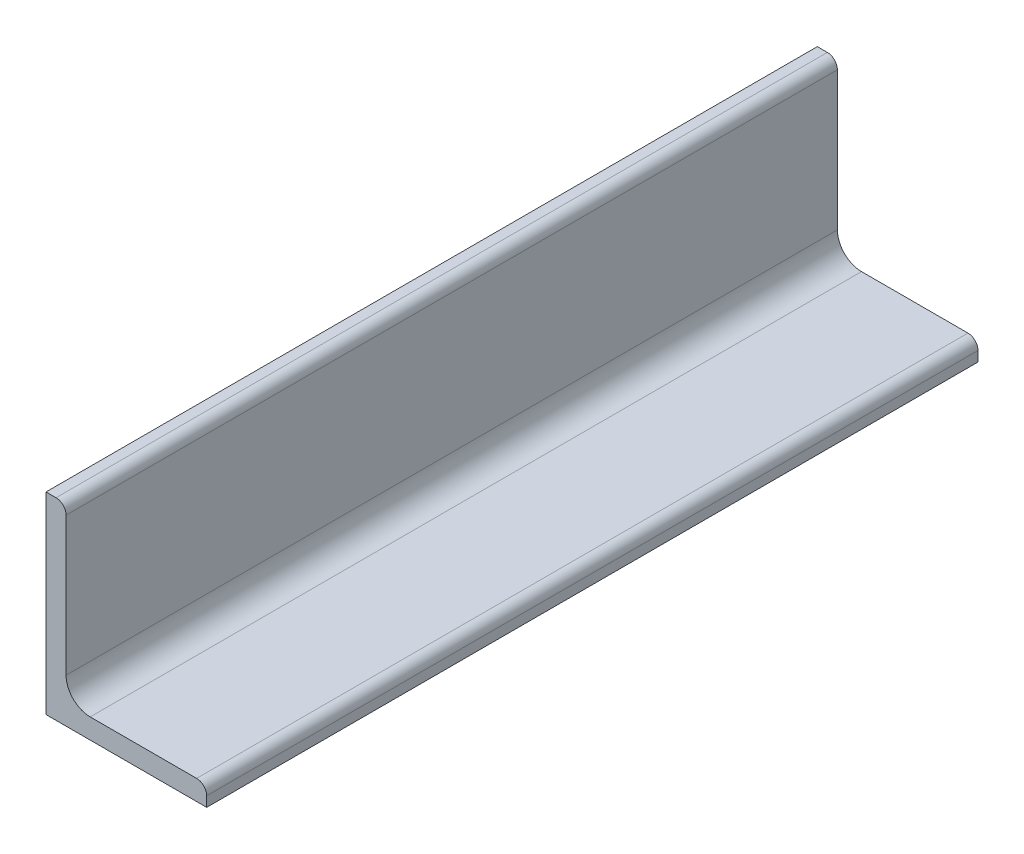
ISO-10303-21;
HEADER;
FILE_DESCRIPTION(('STEP AP214'),'2;1');
FILE_NAME('part.step','',(''),(''),'','','');
FILE_SCHEMA(('AUTOMOTIVE_DESIGN { 1 0 10303 214 1 1 1 1 }'));
ENDSEC;
DATA;
#1=APPLICATION_CONTEXT('core data for automotive mechanical design processes');
#2=APPLICATION_PROTOCOL_DEFINITION('international standard','automotive_design',2000,#1);
#3=PRODUCT_CONTEXT('',#1,'mechanical');
#4=PRODUCT('Part','Part','',(#3));
#5=PRODUCT_RELATED_PRODUCT_CATEGORY('part','',(#4));
#6=PRODUCT_DEFINITION_FORMATION('','',#4);
#7=PRODUCT_DEFINITION_CONTEXT('part definition',#1,'design');
#8=PRODUCT_DEFINITION('design','',#6,#7);
#9=PRODUCT_DEFINITION_SHAPE('','',#8);
#10=(LENGTH_UNIT() NAMED_UNIT(*) SI_UNIT(.MILLI.,.METRE.));
#11=(NAMED_UNIT(*) PLANE_ANGLE_UNIT() SI_UNIT($,.RADIAN.));
#12=(NAMED_UNIT(*) SI_UNIT($,.STERADIAN.) SOLID_ANGLE_UNIT());
#13=UNCERTAINTY_MEASURE_WITH_UNIT(LENGTH_MEASURE(1.E-05),#10,'distance_accuracy_value','');
#14=(GEOMETRIC_REPRESENTATION_CONTEXT(3) GLOBAL_UNCERTAINTY_ASSIGNED_CONTEXT((#13)) GLOBAL_UNIT_ASSIGNED_CONTEXT((#10,
#11,#12)) REPRESENTATION_CONTEXT('',''));
#15=CARTESIAN_POINT('',(0.,0.,0.));
#16=DIRECTION('',(0.,0.,1.));
#17=DIRECTION('',(1.,0.,0.));
#18=AXIS2_PLACEMENT_3D('',#15,#16,#17);
#19=CARTESIAN_POINT('',(0.897927251325018,76.2882459217981,304.8));
#20=DIRECTION('',(1.,0.,0.));
#21=DIRECTION('',(0.,0.,-1.));
#22=AXIS2_PLACEMENT_3D('',#19,#20,#21);
#23=PLANE('',#22);
#24=DIRECTION('',(0.,-1.,0.));
#25=VECTOR('',#24,1.);
#26=CARTESIAN_POINT('',(0.897927251325018,76.2882459217981,0.));
#27=LINE('',#26,#25);
#28=CARTESIAN_POINT('',(0.897927251325018,76.2882459217981,0.));
#29=VERTEX_POINT('',#28);
#30=CARTESIAN_POINT('',(0.897927251325018,0.0882459217980795,0.));
#31=VERTEX_POINT('',#30);
#32=EDGE_CURVE('E135',#29,#31,#27,.T.);
#33=ORIENTED_EDGE('',*,*,#32,.T.);
#34=DIRECTION('',(0.,0.,-1.));
#35=VECTOR('',#34,1.);
#36=CARTESIAN_POINT('',(0.897927251325018,0.0882459217980795,304.8));
#37=LINE('',#36,#35);
#38=CARTESIAN_POINT('',(0.897927251325018,0.0882459217980795,304.8));
#39=VERTEX_POINT('',#38);
#40=EDGE_CURVE('E11',#39,#31,#37,.T.);
#41=ORIENTED_EDGE('',*,*,#40,.F.);
#42=DIRECTION('',(0.,-1.,0.));
#43=VECTOR('',#42,1.);
#44=CARTESIAN_POINT('',(0.897927251325018,76.2882459217981,304.8));
#45=LINE('',#44,#43);
#46=CARTESIAN_POINT('',(0.897927251325018,76.2882459217981,304.8));
#47=VERTEX_POINT('',#46);
#48=EDGE_CURVE('E151',#47,#39,#45,.T.);
#49=ORIENTED_EDGE('',*,*,#48,.F.);
#50=DIRECTION('',(0.,0.,-1.));
#51=VECTOR('',#50,1.);
#52=CARTESIAN_POINT('',(0.897927251325018,76.2882459217981,304.8));
#53=LINE('',#52,#51);
#54=EDGE_CURVE('E131',#47,#29,#53,.T.);
#55=ORIENTED_EDGE('',*,*,#54,.T.);
#56=EDGE_LOOP('',(#33,#41,#49,#55));
#57=FACE_BOUND('',#56,.T.);
#58=ADVANCED_FACE('F33',(#57),#23,.F.);
#59=CARTESIAN_POINT('',(0.897927251325018,0.0882459217980795,304.8));
#60=DIRECTION('',(0.,1.,0.));
#61=DIRECTION('',(0.,0.,1.));
#62=AXIS2_PLACEMENT_3D('',#59,#60,#61);
#63=PLANE('',#62);
#64=DIRECTION('',(1.,0.,0.));
#65=VECTOR('',#64,1.);
#66=CARTESIAN_POINT('',(0.897927251325018,0.0882459217980795,0.));
#67=LINE('',#66,#65);
#68=CARTESIAN_POINT('',(64.397927251325,0.0882459217980795,0.));
#69=VERTEX_POINT('',#68);
#70=EDGE_CURVE('E138',#31,#69,#67,.T.);
#71=ORIENTED_EDGE('',*,*,#70,.T.);
#72=DIRECTION('',(0.,0.,-1.));
#73=VECTOR('',#72,1.);
#74=CARTESIAN_POINT('',(64.397927251325,0.0882459217980795,304.8));
#75=LINE('',#74,#73);
#76=CARTESIAN_POINT('',(64.397927251325,0.0882459217980795,304.8));
#77=VERTEX_POINT('',#76);
#78=EDGE_CURVE('E41',#77,#69,#75,.T.);
#79=ORIENTED_EDGE('',*,*,#78,.F.);
#80=DIRECTION('',(1.,0.,0.));
#81=VECTOR('',#80,1.);
#82=CARTESIAN_POINT('',(0.897927251325018,0.0882459217980795,304.8));
#83=LINE('',#82,#81);
#84=EDGE_CURVE('E95',#39,#77,#83,.T.);
#85=ORIENTED_EDGE('',*,*,#84,.F.);
#86=ORIENTED_EDGE('',*,*,#40,.T.);
#87=EDGE_LOOP('',(#71,#79,#85,#86));
#88=FACE_BOUND('',#87,.T.);
#89=ADVANCED_FACE('F194',(#88),#63,.F.);
#90=CARTESIAN_POINT('',(64.397927251325,0.0882459217980795,304.8));
#91=DIRECTION('',(-1.,0.,0.));
#92=DIRECTION('',(0.,0.,1.));
#93=AXIS2_PLACEMENT_3D('',#90,#91,#92);
#94=PLANE('',#93);
#95=DIRECTION('',(0.,1.,0.));
#96=VECTOR('',#95,1.);
#97=CARTESIAN_POINT('',(64.397927251325,0.0882459217980795,0.));
#98=LINE('',#97,#96);
#99=CARTESIAN_POINT('',(64.397927251325,4.05699592179808,0.));
#100=VERTEX_POINT('',#99);
#101=EDGE_CURVE('E140',#69,#100,#98,.T.);
#102=ORIENTED_EDGE('',*,*,#101,.T.);
#103=DIRECTION('',(0.,0.,-1.));
#104=VECTOR('',#103,1.);
#105=CARTESIAN_POINT('',(64.397927251325,4.05699592179808,304.8));
#106=LINE('',#105,#104);
#107=CARTESIAN_POINT('',(64.397927251325,4.05699592179808,304.8));
#108=VERTEX_POINT('',#107);
#109=EDGE_CURVE('E161',#108,#100,#106,.T.);
#110=ORIENTED_EDGE('',*,*,#109,.F.);
#111=DIRECTION('',(0.,1.,0.));
#112=VECTOR('',#111,1.);
#113=CARTESIAN_POINT('',(64.397927251325,0.0882459217980795,304.8));
#114=LINE('',#113,#112);
#115=EDGE_CURVE('E169',#77,#108,#114,.T.);
#116=ORIENTED_EDGE('',*,*,#115,.F.);
#117=ORIENTED_EDGE('',*,*,#78,.T.);
#118=EDGE_LOOP('',(#102,#110,#116,#117));
#119=FACE_BOUND('',#118,.T.);
#120=ADVANCED_FACE('F167',(#119),#94,.F.);
#121=CARTESIAN_POINT('',(60.429177251325,4.05699592179808,304.8));
#122=DIRECTION('',(0.,0.,-1.));
#123=DIRECTION('',(-1.,0.,0.));
#124=AXIS2_PLACEMENT_3D('',#121,#122,#123);
#125=CYLINDRICAL_SURFACE('',#124,3.96875);
#126=CARTESIAN_POINT('',(60.429177251325,4.05699592179808,0.));
#127=DIRECTION('',(0.,0.,1.));
#128=DIRECTION('',(1.,0.,0.));
#129=AXIS2_PLACEMENT_3D('',#126,#127,#128);
#130=CIRCLE('',#129,3.96875);
#131=CARTESIAN_POINT('',(60.429177251325,8.02574592179808,0.));
#132=VERTEX_POINT('',#131);
#133=EDGE_CURVE('E142',#100,#132,#130,.T.);
#134=ORIENTED_EDGE('',*,*,#133,.T.);
#135=DIRECTION('',(0.,0.,-1.));
#136=VECTOR('',#135,1.);
#137=CARTESIAN_POINT('',(60.429177251325,8.02574592179808,304.8));
#138=LINE('',#137,#136);
#139=CARTESIAN_POINT('',(60.429177251325,8.02574592179808,304.8));
#140=VERTEX_POINT('',#139);
#141=EDGE_CURVE('E158',#140,#132,#138,.T.);
#142=ORIENTED_EDGE('',*,*,#141,.F.);
#143=CARTESIAN_POINT('',(60.429177251325,4.05699592179808,304.8));
#144=DIRECTION('',(0.,0.,1.));
#145=DIRECTION('',(1.,0.,0.));
#146=AXIS2_PLACEMENT_3D('',#143,#144,#145);
#147=CIRCLE('',#146,3.96875);
#148=EDGE_CURVE('E185',#108,#140,#147,.T.);
#149=ORIENTED_EDGE('',*,*,#148,.F.);
#150=ORIENTED_EDGE('',*,*,#109,.T.);
#151=EDGE_LOOP('',(#134,#142,#149,#150));
#152=FACE_BOUND('',#151,.T.);
#153=ADVANCED_FACE('F178',(#152),#125,.T.);
#154=CARTESIAN_POINT('',(60.429177251325,8.02574592179808,304.8));
#155=DIRECTION('',(0.,-1.,0.));
#156=DIRECTION('',(0.,0.,-1.));
#157=AXIS2_PLACEMENT_3D('',#154,#155,#156);
#158=PLANE('',#157);
#159=DIRECTION('',(-1.,0.,0.));
#160=VECTOR('',#159,1.);
#161=CARTESIAN_POINT('',(60.429177251325,8.02574592179808,0.));
#162=LINE('',#161,#160);
#163=CARTESIAN_POINT('',(18.360427251325,8.02574592179808,0.));
#164=VERTEX_POINT('',#163);
#165=EDGE_CURVE('E144',#132,#164,#162,.T.);
#166=ORIENTED_EDGE('',*,*,#165,.T.);
#167=DIRECTION('',(0.,0.,-1.));
#168=VECTOR('',#167,1.);
#169=CARTESIAN_POINT('',(18.360427251325,8.02574592179808,304.8));
#170=LINE('',#169,#168);
#171=CARTESIAN_POINT('',(18.360427251325,8.02574592179808,304.8));
#172=VERTEX_POINT('',#171);
#173=EDGE_CURVE('E155',#172,#164,#170,.T.);
#174=ORIENTED_EDGE('',*,*,#173,.F.);
#175=DIRECTION('',(-1.,0.,0.));
#176=VECTOR('',#175,1.);
#177=CARTESIAN_POINT('',(60.429177251325,8.02574592179808,304.8));
#178=LINE('',#177,#176);
#179=EDGE_CURVE('E184',#140,#172,#178,.T.);
#180=ORIENTED_EDGE('',*,*,#179,.F.);
#181=ORIENTED_EDGE('',*,*,#141,.T.);
#182=EDGE_LOOP('',(#166,#174,#180,#181));
#183=FACE_BOUND('',#182,.T.);
#184=ADVANCED_FACE('F182',(#183),#158,.F.);
#185=CARTESIAN_POINT('',(18.360427251325,17.5507459217981,304.8));
#186=DIRECTION('',(0.,0.,-1.));
#187=DIRECTION('',(-1.,0.,0.));
#188=AXIS2_PLACEMENT_3D('',#185,#186,#187);
#189=CYLINDRICAL_SURFACE('',#188,9.52499999999999);
#190=CARTESIAN_POINT('',(18.360427251325,17.5507459217981,0.));
#191=DIRECTION('',(0.,0.,-1.));
#192=DIRECTION('',(1.,0.,0.));
#193=AXIS2_PLACEMENT_3D('',#190,#191,#192);
#194=CIRCLE('',#193,9.52499999999999);
#195=CARTESIAN_POINT('',(8.83542725132502,17.5507459217981,0.));
#196=VERTEX_POINT('',#195);
#197=EDGE_CURVE('E146',#164,#196,#194,.T.);
#198=ORIENTED_EDGE('',*,*,#197,.T.);
#199=DIRECTION('',(0.,0.,-1.));
#200=VECTOR('',#199,1.);
#201=CARTESIAN_POINT('',(8.83542725132502,17.5507459217981,304.8));
#202=LINE('',#201,#200);
#203=CARTESIAN_POINT('',(8.83542725132502,17.5507459217981,304.8));
#204=VERTEX_POINT('',#203);
#205=EDGE_CURVE('E126',#204,#196,#202,.T.);
#206=ORIENTED_EDGE('',*,*,#205,.F.);
#207=CARTESIAN_POINT('',(18.360427251325,17.5507459217981,304.8));
#208=DIRECTION('',(0.,0.,-1.));
#209=DIRECTION('',(1.,0.,0.));
#210=AXIS2_PLACEMENT_3D('',#207,#208,#209);
#211=CIRCLE('',#210,9.52499999999999);
#212=EDGE_CURVE('E117',#172,#204,#211,.T.);
#213=ORIENTED_EDGE('',*,*,#212,.F.);
#214=ORIENTED_EDGE('',*,*,#173,.T.);
#215=EDGE_LOOP('',(#198,#206,#213,#214));
#216=FACE_BOUND('',#215,.T.);
#217=ADVANCED_FACE('F206',(#216),#189,.F.);
#218=CARTESIAN_POINT('',(8.83542725132502,17.5507459217981,304.8));
#219=DIRECTION('',(-1.,0.,0.));
#220=DIRECTION('',(0.,0.,1.));
#221=AXIS2_PLACEMENT_3D('',#218,#219,#220);
#222=PLANE('',#221);
#223=DIRECTION('',(0.,1.,0.));
#224=VECTOR('',#223,1.);
#225=CARTESIAN_POINT('',(8.83542725132502,17.5507459217981,0.));
#226=LINE('',#225,#224);
#227=CARTESIAN_POINT('',(8.83542725132502,72.3194959217981,0.));
#228=VERTEX_POINT('',#227);
#229=EDGE_CURVE('E125',#196,#228,#226,.T.);
#230=ORIENTED_EDGE('',*,*,#229,.T.);
#231=DIRECTION('',(0.,0.,-1.));
#232=VECTOR('',#231,1.);
#233=CARTESIAN_POINT('',(8.83542725132502,72.3194959217981,304.8));
#234=LINE('',#233,#232);
#235=CARTESIAN_POINT('',(8.83542725132502,72.3194959217981,304.8));
#236=VERTEX_POINT('',#235);
#237=EDGE_CURVE('E122',#236,#228,#234,.T.);
#238=ORIENTED_EDGE('',*,*,#237,.F.);
#239=DIRECTION('',(0.,1.,0.));
#240=VECTOR('',#239,1.);
#241=CARTESIAN_POINT('',(8.83542725132502,17.5507459217981,304.8));
#242=LINE('',#241,#240);
#243=EDGE_CURVE('E111',#204,#236,#242,.T.);
#244=ORIENTED_EDGE('',*,*,#243,.F.);
#245=ORIENTED_EDGE('',*,*,#205,.T.);
#246=EDGE_LOOP('',(#230,#238,#244,#245));
#247=FACE_BOUND('',#246,.T.);
#248=ADVANCED_FACE('F123',(#247),#222,.F.);
#249=CARTESIAN_POINT('',(4.86667725132502,72.3194959217981,304.8));
#250=DIRECTION('',(0.,0.,-1.));
#251=DIRECTION('',(-1.,0.,0.));
#252=AXIS2_PLACEMENT_3D('',#249,#250,#251);
#253=CYLINDRICAL_SURFACE('',#252,3.96875);
#254=CARTESIAN_POINT('',(4.86667725132502,72.3194959217981,0.));
#255=DIRECTION('',(0.,0.,1.));
#256=DIRECTION('',(1.,0.,0.));
#257=AXIS2_PLACEMENT_3D('',#254,#255,#256);
#258=CIRCLE('',#257,3.96875);
#259=CARTESIAN_POINT('',(4.86667725132502,76.2882459217981,0.));
#260=VERTEX_POINT('',#259);
#261=EDGE_CURVE('E81',#228,#260,#258,.T.);
#262=ORIENTED_EDGE('',*,*,#261,.T.);
#263=DIRECTION('',(0.,0.,-1.));
#264=VECTOR('',#263,1.);
#265=CARTESIAN_POINT('',(4.86667725132502,76.2882459217981,304.8));
#266=LINE('',#265,#264);
#267=CARTESIAN_POINT('',(4.86667725132502,76.2882459217981,304.8));
#268=VERTEX_POINT('',#267);
#269=EDGE_CURVE('E127',#268,#260,#266,.T.);
#270=ORIENTED_EDGE('',*,*,#269,.F.);
#271=CARTESIAN_POINT('',(4.86667725132502,72.3194959217981,304.8));
#272=DIRECTION('',(0.,0.,1.));
#273=DIRECTION('',(1.,0.,0.));
#274=AXIS2_PLACEMENT_3D('',#271,#272,#273);
#275=CIRCLE('',#274,3.96875);
#276=EDGE_CURVE('E115',#236,#268,#275,.T.);
#277=ORIENTED_EDGE('',*,*,#276,.F.);
#278=ORIENTED_EDGE('',*,*,#237,.T.);
#279=EDGE_LOOP('',(#262,#270,#277,#278));
#280=FACE_BOUND('',#279,.T.);
#281=ADVANCED_FACE('F129',(#280),#253,.T.);
#282=CARTESIAN_POINT('',(4.86667725132502,76.2882459217981,304.8));
#283=DIRECTION('',(0.,-1.,0.));
#284=DIRECTION('',(0.,0.,-1.));
#285=AXIS2_PLACEMENT_3D('',#282,#283,#284);
#286=PLANE('',#285);
#287=DIRECTION('',(-1.,0.,0.));
#288=VECTOR('',#287,1.);
#289=CARTESIAN_POINT('',(4.86667725132502,76.2882459217981,0.));
#290=LINE('',#289,#288);
#291=EDGE_CURVE('E87',#260,#29,#290,.T.);
#292=ORIENTED_EDGE('',*,*,#291,.T.);
#293=ORIENTED_EDGE('',*,*,#54,.F.);
#294=DIRECTION('',(-1.,0.,0.));
#295=VECTOR('',#294,1.);
#296=CARTESIAN_POINT('',(4.86667725132502,76.2882459217981,304.8));
#297=LINE('',#296,#295);
#298=EDGE_CURVE('E49',#268,#47,#297,.T.);
#299=ORIENTED_EDGE('',*,*,#298,.F.);
#300=ORIENTED_EDGE('',*,*,#269,.T.);
#301=EDGE_LOOP('',(#292,#293,#299,#300));
#302=FACE_BOUND('',#301,.T.);
#303=ADVANCED_FACE('F214',(#302),#286,.F.);
#304=CARTESIAN_POINT('',(60.429177251325,4.05699592179808,304.8));
#305=DIRECTION('',(0.,0.,1.));
#306=DIRECTION('',(1.,0.,0.));
#307=AXIS2_PLACEMENT_3D('',#304,#305,#306);
#308=PLANE('',#307);
#309=ORIENTED_EDGE('',*,*,#48,.T.);
#310=ORIENTED_EDGE('',*,*,#84,.T.);
#311=ORIENTED_EDGE('',*,*,#115,.T.);
#312=ORIENTED_EDGE('',*,*,#148,.T.);
#313=ORIENTED_EDGE('',*,*,#179,.T.);
#314=ORIENTED_EDGE('',*,*,#212,.T.);
#315=ORIENTED_EDGE('',*,*,#243,.T.);
#316=ORIENTED_EDGE('',*,*,#276,.T.);
#317=ORIENTED_EDGE('',*,*,#298,.T.);
#318=EDGE_LOOP('',(#309,#310,#311,#312,#313,#314,#315,#316,#317));
#319=FACE_BOUND('',#318,.T.);
#320=ADVANCED_FACE('F113',(#319),#308,.T.);
#321=CARTESIAN_POINT('',(60.429177251325,4.05699592179808,0.));
#322=DIRECTION('',(0.,0.,1.));
#323=DIRECTION('',(1.,0.,0.));
#324=AXIS2_PLACEMENT_3D('',#321,#322,#323);
#325=PLANE('',#324);
#326=ORIENTED_EDGE('',*,*,#32,.F.);
#327=ORIENTED_EDGE('',*,*,#291,.F.);
#328=ORIENTED_EDGE('',*,*,#261,.F.);
#329=ORIENTED_EDGE('',*,*,#229,.F.);
#330=ORIENTED_EDGE('',*,*,#197,.F.);
#331=ORIENTED_EDGE('',*,*,#165,.F.);
#332=ORIENTED_EDGE('',*,*,#133,.F.);
#333=ORIENTED_EDGE('',*,*,#101,.F.);
#334=ORIENTED_EDGE('',*,*,#70,.F.);
#335=EDGE_LOOP('',(#326,#327,#328,#329,#330,#331,#332,#333,#334));
#336=FACE_BOUND('',#335,.T.);
#337=ADVANCED_FACE('F173',(#336),#325,.F.);
#338=CLOSED_SHELL('',(#58,#89,#120,#153,#184,#217,#248,#281,#303,#320,#337));
#339=MANIFOLD_SOLID_BREP('B2',#338);
#340=ADVANCED_BREP_SHAPE_REPRESENTATION('',(#18,#339),#14);
#341=SHAPE_DEFINITION_REPRESENTATION(#9,#340);
ENDSEC;
END-ISO-10303-21;
